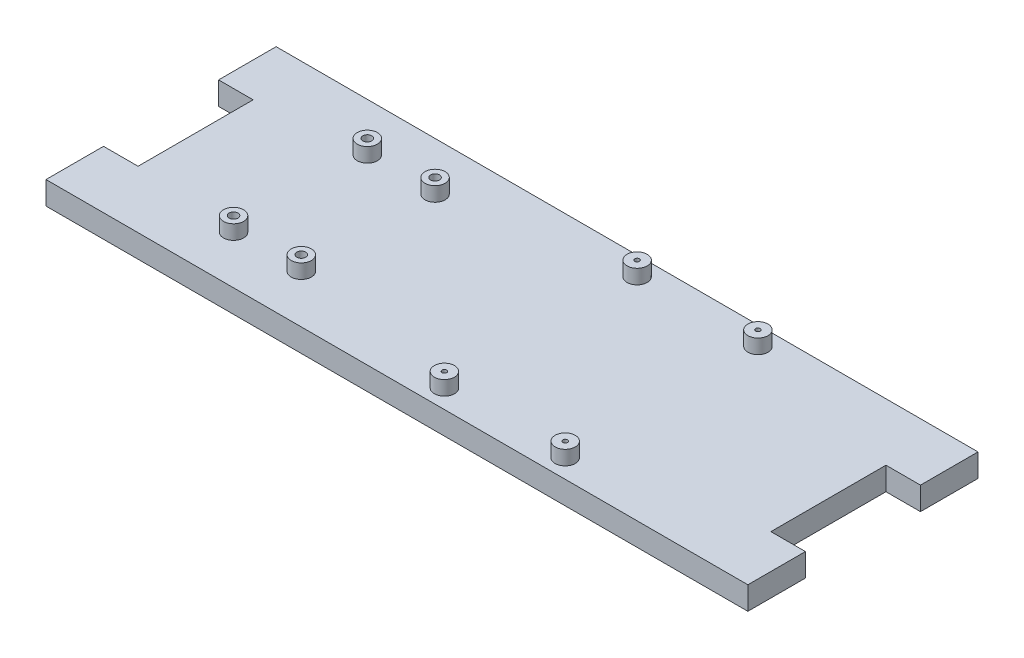
ISO-10303-21;
HEADER;
FILE_DESCRIPTION(('STEP AP214'),'2;1');
FILE_NAME('part.step','',(''),(''),'','','');
FILE_SCHEMA(('AUTOMOTIVE_DESIGN { 1 0 10303 214 1 1 1 1 }'));
ENDSEC;
DATA;
#1=APPLICATION_CONTEXT('core data for automotive mechanical design processes');
#2=APPLICATION_PROTOCOL_DEFINITION('international standard','automotive_design',2000,#1);
#3=PRODUCT_CONTEXT('',#1,'mechanical');
#4=PRODUCT('Part','Part','',(#3));
#5=PRODUCT_RELATED_PRODUCT_CATEGORY('part','',(#4));
#6=PRODUCT_DEFINITION_FORMATION('','',#4);
#7=PRODUCT_DEFINITION_CONTEXT('part definition',#1,'design');
#8=PRODUCT_DEFINITION('design','',#6,#7);
#9=PRODUCT_DEFINITION_SHAPE('','',#8);
#10=(LENGTH_UNIT() NAMED_UNIT(*) SI_UNIT(.MILLI.,.METRE.));
#11=(NAMED_UNIT(*) PLANE_ANGLE_UNIT() SI_UNIT($,.RADIAN.));
#12=(NAMED_UNIT(*) SI_UNIT($,.STERADIAN.) SOLID_ANGLE_UNIT());
#13=UNCERTAINTY_MEASURE_WITH_UNIT(LENGTH_MEASURE(1.E-05),#10,'distance_accuracy_value','');
#14=(GEOMETRIC_REPRESENTATION_CONTEXT(3) GLOBAL_UNCERTAINTY_ASSIGNED_CONTEXT((#13)) GLOBAL_UNIT_ASSIGNED_CONTEXT((#10,
#11,#12)) REPRESENTATION_CONTEXT('',''));
#15=CARTESIAN_POINT('',(0.,0.,0.));
#16=DIRECTION('',(0.,0.,1.));
#17=DIRECTION('',(1.,0.,0.));
#18=AXIS2_PLACEMENT_3D('',#15,#16,#17);
#19=CARTESIAN_POINT('',(0.,8.,0.));
#20=DIRECTION('',(0.,1.,0.));
#21=DIRECTION('',(0.,0.,1.));
#22=AXIS2_PLACEMENT_3D('',#19,#20,#21);
#23=PLANE('',#22);
#24=CARTESIAN_POINT('',(52.,8.,-33.5));
#25=DIRECTION('',(0.,1.,0.));
#26=DIRECTION('',(0.,0.,1.));
#27=AXIS2_PLACEMENT_3D('',#24,#25,#26);
#28=CIRCLE('',#27,3.5);
#29=CARTESIAN_POINT('',(52.,8.,-30.));
#30=VERTEX_POINT('',#29);
#31=EDGE_CURVE('E678',#30,#30,#28,.T.);
#32=ORIENTED_EDGE('',*,*,#31,.F.);
#33=EDGE_LOOP('',(#32));
#34=FACE_BOUND('',#33,.T.);
#35=CARTESIAN_POINT('',(10.,8.,33.5));
#36=DIRECTION('',(0.,1.,0.));
#37=DIRECTION('',(0.,0.,1.));
#38=AXIS2_PLACEMENT_3D('',#35,#36,#37);
#39=CIRCLE('',#38,3.5);
#40=CARTESIAN_POINT('',(10.,8.,37.));
#41=VERTEX_POINT('',#40);
#42=EDGE_CURVE('E696',#41,#41,#39,.T.);
#43=ORIENTED_EDGE('',*,*,#42,.F.);
#44=EDGE_LOOP('',(#43));
#45=FACE_BOUND('',#44,.T.);
#46=CARTESIAN_POINT('',(-73.55,8.,23.25));
#47=DIRECTION('',(0.,1.,0.));
#48=DIRECTION('',(0.,0.,1.));
#49=AXIS2_PLACEMENT_3D('',#46,#47,#48);
#50=CIRCLE('',#49,3.50000000000001);
#51=CARTESIAN_POINT('',(-73.55,8.,26.75));
#52=VERTEX_POINT('',#51);
#53=EDGE_CURVE('E714',#52,#52,#50,.T.);
#54=ORIENTED_EDGE('',*,*,#53,.F.);
#55=EDGE_LOOP('',(#54));
#56=FACE_BOUND('',#55,.T.);
#57=CARTESIAN_POINT('',(-73.55,8.,-23.25));
#58=DIRECTION('',(0.,1.,0.));
#59=DIRECTION('',(0.,0.,1.));
#60=AXIS2_PLACEMENT_3D('',#57,#58,#59);
#61=CIRCLE('',#60,3.50000000000001);
#62=CARTESIAN_POINT('',(-73.55,8.,-19.75));
#63=VERTEX_POINT('',#62);
#64=EDGE_CURVE('E734',#63,#63,#61,.T.);
#65=ORIENTED_EDGE('',*,*,#64,.F.);
#66=EDGE_LOOP('',(#65));
#67=FACE_BOUND('',#66,.T.);
#68=DIRECTION('',(1.,0.,0.));
#69=VECTOR('',#68,1.);
#70=CARTESIAN_POINT('',(-110.,8.,40.));
#71=LINE('',#70,#69);
#72=CARTESIAN_POINT('',(-122.,8.,40.));
#73=VERTEX_POINT('',#72);
#74=CARTESIAN_POINT('',(122.,8.,40.));
#75=VERTEX_POINT('',#74);
#76=EDGE_CURVE('E11',#73,#75,#71,.T.);
#77=ORIENTED_EDGE('',*,*,#76,.T.);
#78=DIRECTION('',(0.,0.,-1.));
#79=VECTOR('',#78,1.);
#80=CARTESIAN_POINT('',(122.,8.,40.));
#81=LINE('',#80,#79);
#82=CARTESIAN_POINT('',(122.,8.,20.));
#83=VERTEX_POINT('',#82);
#84=EDGE_CURVE('E188',#75,#83,#81,.T.);
#85=ORIENTED_EDGE('',*,*,#84,.T.);
#86=DIRECTION('',(-1.,0.,0.));
#87=VECTOR('',#86,1.);
#88=CARTESIAN_POINT('',(122.,8.,20.));
#89=LINE('',#88,#87);
#90=CARTESIAN_POINT('',(110.,8.,20.));
#91=VERTEX_POINT('',#90);
#92=EDGE_CURVE('E190',#83,#91,#89,.T.);
#93=ORIENTED_EDGE('',*,*,#92,.T.);
#94=DIRECTION('',(0.,0.,-1.));
#95=VECTOR('',#94,1.);
#96=CARTESIAN_POINT('',(110.,8.,-40.));
#97=LINE('',#96,#95);
#98=CARTESIAN_POINT('',(110.,8.,-20.));
#99=VERTEX_POINT('',#98);
#100=EDGE_CURVE('E218',#91,#99,#97,.T.);
#101=ORIENTED_EDGE('',*,*,#100,.T.);
#102=DIRECTION('',(-1.,0.,0.));
#103=VECTOR('',#102,1.);
#104=CARTESIAN_POINT('',(122.,8.,-20.));
#105=LINE('',#104,#103);
#106=CARTESIAN_POINT('',(122.,8.,-20.));
#107=VERTEX_POINT('',#106);
#108=EDGE_CURVE('E214',#107,#99,#105,.T.);
#109=ORIENTED_EDGE('',*,*,#108,.F.);
#110=DIRECTION('',(0.,0.,1.));
#111=VECTOR('',#110,1.);
#112=CARTESIAN_POINT('',(122.,8.,-40.));
#113=LINE('',#112,#111);
#114=CARTESIAN_POINT('',(122.,8.,-40.));
#115=VERTEX_POINT('',#114);
#116=EDGE_CURVE('E202',#115,#107,#113,.T.);
#117=ORIENTED_EDGE('',*,*,#116,.F.);
#118=DIRECTION('',(-1.,0.,0.));
#119=VECTOR('',#118,1.);
#120=CARTESIAN_POINT('',(-110.,8.,-40.));
#121=LINE('',#120,#119);
#122=CARTESIAN_POINT('',(-122.,8.,-40.));
#123=VERTEX_POINT('',#122);
#124=EDGE_CURVE('E220',#115,#123,#121,.T.);
#125=ORIENTED_EDGE('',*,*,#124,.T.);
#126=DIRECTION('',(0.,0.,1.));
#127=VECTOR('',#126,1.);
#128=CARTESIAN_POINT('',(-122.,8.,-40.));
#129=LINE('',#128,#127);
#130=CARTESIAN_POINT('',(-122.,8.,-20.));
#131=VERTEX_POINT('',#130);
#132=EDGE_CURVE('E172',#123,#131,#129,.T.);
#133=ORIENTED_EDGE('',*,*,#132,.T.);
#134=DIRECTION('',(1.,0.,0.));
#135=VECTOR('',#134,1.);
#136=CARTESIAN_POINT('',(-122.,8.,-20.));
#137=LINE('',#136,#135);
#138=CARTESIAN_POINT('',(-110.,8.,-20.));
#139=VERTEX_POINT('',#138);
#140=EDGE_CURVE('E175',#131,#139,#137,.T.);
#141=ORIENTED_EDGE('',*,*,#140,.T.);
#142=DIRECTION('',(0.,0.,1.));
#143=VECTOR('',#142,1.);
#144=CARTESIAN_POINT('',(-110.,8.,-40.));
#145=LINE('',#144,#143);
#146=CARTESIAN_POINT('',(-110.,8.,20.));
#147=VERTEX_POINT('',#146);
#148=EDGE_CURVE('E47',#139,#147,#145,.T.);
#149=ORIENTED_EDGE('',*,*,#148,.T.);
#150=DIRECTION('',(1.,0.,0.));
#151=VECTOR('',#150,1.);
#152=CARTESIAN_POINT('',(-122.,8.,20.));
#153=LINE('',#152,#151);
#154=CARTESIAN_POINT('',(-122.,8.,20.));
#155=VERTEX_POINT('',#154);
#156=EDGE_CURVE('E141',#155,#147,#153,.T.);
#157=ORIENTED_EDGE('',*,*,#156,.F.);
#158=DIRECTION('',(0.,0.,-1.));
#159=VECTOR('',#158,1.);
#160=CARTESIAN_POINT('',(-122.,8.,40.));
#161=LINE('',#160,#159);
#162=EDGE_CURVE('E138',#73,#155,#161,.T.);
#163=ORIENTED_EDGE('',*,*,#162,.F.);
#164=EDGE_LOOP('',(#77,#85,#93,#101,#109,#117,#125,#133,#141,#149,#157,#163));
#165=FACE_BOUND('',#164,.T.);
#166=CARTESIAN_POINT('',(-50.,8.,-23.25));
#167=DIRECTION('',(0.,1.,0.));
#168=DIRECTION('',(0.,0.,1.));
#169=AXIS2_PLACEMENT_3D('',#166,#167,#168);
#170=CIRCLE('',#169,3.5);
#171=CARTESIAN_POINT('',(-50.,8.,-19.75));
#172=VERTEX_POINT('',#171);
#173=EDGE_CURVE('E723',#172,#172,#170,.T.);
#174=ORIENTED_EDGE('',*,*,#173,.F.);
#175=EDGE_LOOP('',(#174));
#176=FACE_BOUND('',#175,.T.);
#177=CARTESIAN_POINT('',(-50.,8.,23.25));
#178=DIRECTION('',(0.,1.,0.));
#179=DIRECTION('',(0.,0.,1.));
#180=AXIS2_PLACEMENT_3D('',#177,#178,#179);
#181=CIRCLE('',#180,3.5);
#182=CARTESIAN_POINT('',(-50.,8.,26.75));
#183=VERTEX_POINT('',#182);
#184=EDGE_CURVE('E705',#183,#183,#181,.T.);
#185=ORIENTED_EDGE('',*,*,#184,.F.);
#186=EDGE_LOOP('',(#185));
#187=FACE_BOUND('',#186,.T.);
#188=CARTESIAN_POINT('',(52.,8.,33.5));
#189=DIRECTION('',(0.,1.,0.));
#190=DIRECTION('',(0.,0.,1.));
#191=AXIS2_PLACEMENT_3D('',#188,#189,#190);
#192=CIRCLE('',#191,3.5);
#193=CARTESIAN_POINT('',(52.,8.,37.));
#194=VERTEX_POINT('',#193);
#195=EDGE_CURVE('E687',#194,#194,#192,.T.);
#196=ORIENTED_EDGE('',*,*,#195,.F.);
#197=EDGE_LOOP('',(#196));
#198=FACE_BOUND('',#197,.T.);
#199=CARTESIAN_POINT('',(9.99999999999999,8.,-33.5));
#200=DIRECTION('',(0.,1.,0.));
#201=DIRECTION('',(0.,0.,1.));
#202=AXIS2_PLACEMENT_3D('',#199,#200,#201);
#203=CIRCLE('',#202,3.5);
#204=CARTESIAN_POINT('',(9.99999999999999,8.,-30.));
#205=VERTEX_POINT('',#204);
#206=EDGE_CURVE('E669',#205,#205,#203,.T.);
#207=ORIENTED_EDGE('',*,*,#206,.F.);
#208=EDGE_LOOP('',(#207));
#209=FACE_BOUND('',#208,.T.);
#210=ADVANCED_FACE('F38',(#34,#45,#56,#67,#165,#176,#187,#198,#209),#23,.T.);
#211=CARTESIAN_POINT('',(-110.,8.,-40.));
#212=DIRECTION('',(1.,0.,0.));
#213=DIRECTION('',(0.,0.,-1.));
#214=AXIS2_PLACEMENT_3D('',#211,#212,#213);
#215=PLANE('',#214);
#216=DIRECTION('',(0.,-1.,0.));
#217=VECTOR('',#216,1.);
#218=CARTESIAN_POINT('',(-110.,8.,20.));
#219=LINE('',#218,#217);
#220=CARTESIAN_POINT('',(-110.,0.,20.));
#221=VERTEX_POINT('',#220);
#222=EDGE_CURVE('E55',#147,#221,#219,.T.);
#223=ORIENTED_EDGE('',*,*,#222,.F.);
#224=ORIENTED_EDGE('',*,*,#148,.F.);
#225=DIRECTION('',(0.,-1.,0.));
#226=VECTOR('',#225,1.);
#227=CARTESIAN_POINT('',(-110.,8.,-20.));
#228=LINE('',#227,#226);
#229=CARTESIAN_POINT('',(-110.,0.,-20.));
#230=VERTEX_POINT('',#229);
#231=EDGE_CURVE('E162',#139,#230,#228,.T.);
#232=ORIENTED_EDGE('',*,*,#231,.T.);
#233=DIRECTION('',(0.,0.,1.));
#234=VECTOR('',#233,1.);
#235=CARTESIAN_POINT('',(-110.,0.,-40.));
#236=LINE('',#235,#234);
#237=EDGE_CURVE('E60',#230,#221,#236,.T.);
#238=ORIENTED_EDGE('',*,*,#237,.T.);
#239=EDGE_LOOP('',(#223,#224,#232,#238));
#240=FACE_BOUND('',#239,.T.);
#241=ADVANCED_FACE('F270',(#240),#215,.F.);
#242=CARTESIAN_POINT('',(110.,8.,-40.));
#243=DIRECTION('',(-1.,0.,0.));
#244=DIRECTION('',(0.,0.,1.));
#245=AXIS2_PLACEMENT_3D('',#242,#243,#244);
#246=PLANE('',#245);
#247=ORIENTED_EDGE('',*,*,#100,.F.);
#248=DIRECTION('',(0.,-1.,0.));
#249=VECTOR('',#248,1.);
#250=CARTESIAN_POINT('',(110.,8.,20.));
#251=LINE('',#250,#249);
#252=CARTESIAN_POINT('',(110.,0.,20.));
#253=VERTEX_POINT('',#252);
#254=EDGE_CURVE('E180',#91,#253,#251,.T.);
#255=ORIENTED_EDGE('',*,*,#254,.T.);
#256=DIRECTION('',(0.,0.,-1.));
#257=VECTOR('',#256,1.);
#258=CARTESIAN_POINT('',(110.,0.,-40.));
#259=LINE('',#258,#257);
#260=CARTESIAN_POINT('',(110.,0.,-20.));
#261=VERTEX_POINT('',#260);
#262=EDGE_CURVE('E217',#253,#261,#259,.T.);
#263=ORIENTED_EDGE('',*,*,#262,.T.);
#264=DIRECTION('',(0.,-1.,0.));
#265=VECTOR('',#264,1.);
#266=CARTESIAN_POINT('',(110.,8.,-20.));
#267=LINE('',#266,#265);
#268=EDGE_CURVE('E198',#99,#261,#267,.T.);
#269=ORIENTED_EDGE('',*,*,#268,.F.);
#270=EDGE_LOOP('',(#247,#255,#263,#269));
#271=FACE_BOUND('',#270,.T.);
#272=ADVANCED_FACE('F40',(#271),#246,.F.);
#273=CARTESIAN_POINT('',(-110.,8.,-40.));
#274=DIRECTION('',(0.,0.,1.));
#275=DIRECTION('',(1.,0.,0.));
#276=AXIS2_PLACEMENT_3D('',#273,#274,#275);
#277=PLANE('',#276);
#278=DIRECTION('',(-1.,0.,0.));
#279=VECTOR('',#278,1.);
#280=CARTESIAN_POINT('',(-110.,0.,-40.));
#281=LINE('',#280,#279);
#282=CARTESIAN_POINT('',(122.,0.,-40.));
#283=VERTEX_POINT('',#282);
#284=CARTESIAN_POINT('',(-122.,0.,-40.));
#285=VERTEX_POINT('',#284);
#286=EDGE_CURVE('E224',#283,#285,#281,.T.);
#287=ORIENTED_EDGE('',*,*,#286,.T.);
#288=DIRECTION('',(0.,1.,0.));
#289=VECTOR('',#288,1.);
#290=CARTESIAN_POINT('',(-122.,8.,-40.));
#291=LINE('',#290,#289);
#292=EDGE_CURVE('E163',#285,#123,#291,.T.);
#293=ORIENTED_EDGE('',*,*,#292,.T.);
#294=ORIENTED_EDGE('',*,*,#124,.F.);
#295=DIRECTION('',(0.,1.,0.));
#296=VECTOR('',#295,1.);
#297=CARTESIAN_POINT('',(122.,8.,-40.));
#298=LINE('',#297,#296);
#299=EDGE_CURVE('E199',#283,#115,#298,.T.);
#300=ORIENTED_EDGE('',*,*,#299,.F.);
#301=EDGE_LOOP('',(#287,#293,#294,#300));
#302=FACE_BOUND('',#301,.T.);
#303=ADVANCED_FACE('F249',(#302),#277,.F.);
#304=CARTESIAN_POINT('',(-110.,8.,40.));
#305=DIRECTION('',(0.,0.,-1.));
#306=DIRECTION('',(-1.,0.,0.));
#307=AXIS2_PLACEMENT_3D('',#304,#305,#306);
#308=PLANE('',#307);
#309=DIRECTION('',(1.,0.,0.));
#310=VECTOR('',#309,1.);
#311=CARTESIAN_POINT('',(-110.,0.,40.));
#312=LINE('',#311,#310);
#313=CARTESIAN_POINT('',(-122.,0.,40.));
#314=VERTEX_POINT('',#313);
#315=CARTESIAN_POINT('',(122.,0.,40.));
#316=VERTEX_POINT('',#315);
#317=EDGE_CURVE('E42',#314,#316,#312,.T.);
#318=ORIENTED_EDGE('',*,*,#317,.T.);
#319=DIRECTION('',(0.,1.,0.));
#320=VECTOR('',#319,1.);
#321=CARTESIAN_POINT('',(122.,8.,40.));
#322=LINE('',#321,#320);
#323=EDGE_CURVE('E133',#316,#75,#322,.T.);
#324=ORIENTED_EDGE('',*,*,#323,.T.);
#325=ORIENTED_EDGE('',*,*,#76,.F.);
#326=DIRECTION('',(0.,1.,0.));
#327=VECTOR('',#326,1.);
#328=CARTESIAN_POINT('',(-122.,8.,40.));
#329=LINE('',#328,#327);
#330=EDGE_CURVE('E131',#314,#73,#329,.T.);
#331=ORIENTED_EDGE('',*,*,#330,.F.);
#332=EDGE_LOOP('',(#318,#324,#325,#331));
#333=FACE_BOUND('',#332,.T.);
#334=ADVANCED_FACE('F129',(#333),#308,.F.);
#335=CARTESIAN_POINT('',(0.,0.,0.));
#336=DIRECTION('',(0.,1.,0.));
#337=DIRECTION('',(0.,0.,1.));
#338=AXIS2_PLACEMENT_3D('',#335,#336,#337);
#339=PLANE('',#338);
#340=CARTESIAN_POINT('',(52.,0.,-33.5));
#341=DIRECTION('',(0.,1.,0.));
#342=DIRECTION('',(0.,0.,1.));
#343=AXIS2_PLACEMENT_3D('',#340,#341,#342);
#344=CIRCLE('',#343,0.80000000000001);
#345=CARTESIAN_POINT('',(52.,0.,-32.7));
#346=VERTEX_POINT('',#345);
#347=EDGE_CURVE('E750',#346,#346,#344,.T.);
#348=ORIENTED_EDGE('',*,*,#347,.T.);
#349=EDGE_LOOP('',(#348));
#350=FACE_BOUND('',#349,.T.);
#351=CARTESIAN_POINT('',(52.,0.,33.5));
#352=DIRECTION('',(0.,1.,0.));
#353=DIRECTION('',(0.,0.,1.));
#354=AXIS2_PLACEMENT_3D('',#351,#352,#353);
#355=CIRCLE('',#354,0.799999999999981);
#356=CARTESIAN_POINT('',(52.,0.,34.3));
#357=VERTEX_POINT('',#356);
#358=EDGE_CURVE('E753',#357,#357,#355,.T.);
#359=ORIENTED_EDGE('',*,*,#358,.T.);
#360=EDGE_LOOP('',(#359));
#361=FACE_BOUND('',#360,.T.);
#362=CARTESIAN_POINT('',(10.,0.,33.5));
#363=DIRECTION('',(0.,1.,0.));
#364=DIRECTION('',(0.,0.,1.));
#365=AXIS2_PLACEMENT_3D('',#362,#363,#364);
#366=CIRCLE('',#365,0.799999999999983);
#367=CARTESIAN_POINT('',(10.,0.,34.3));
#368=VERTEX_POINT('',#367);
#369=EDGE_CURVE('E756',#368,#368,#366,.T.);
#370=ORIENTED_EDGE('',*,*,#369,.T.);
#371=EDGE_LOOP('',(#370));
#372=FACE_BOUND('',#371,.T.);
#373=CARTESIAN_POINT('',(-73.55,0.,-23.25));
#374=DIRECTION('',(0.,1.,0.));
#375=DIRECTION('',(0.,0.,1.));
#376=AXIS2_PLACEMENT_3D('',#373,#374,#375);
#377=CIRCLE('',#376,1.54999999999999);
#378=CARTESIAN_POINT('',(-73.55,0.,-21.7));
#379=VERTEX_POINT('',#378);
#380=EDGE_CURVE('E744',#379,#379,#377,.T.);
#381=ORIENTED_EDGE('',*,*,#380,.T.);
#382=EDGE_LOOP('',(#381));
#383=FACE_BOUND('',#382,.T.);
#384=CARTESIAN_POINT('',(-50.,0.,-23.25));
#385=DIRECTION('',(0.,1.,0.));
#386=DIRECTION('',(0.,0.,1.));
#387=AXIS2_PLACEMENT_3D('',#384,#385,#386);
#388=CIRCLE('',#387,1.54999999999999);
#389=CARTESIAN_POINT('',(-50.,0.,-21.7));
#390=VERTEX_POINT('',#389);
#391=EDGE_CURVE('E741',#390,#390,#388,.T.);
#392=ORIENTED_EDGE('',*,*,#391,.T.);
#393=EDGE_LOOP('',(#392));
#394=FACE_BOUND('',#393,.T.);
#395=CARTESIAN_POINT('',(-50.,0.,23.25));
#396=DIRECTION('',(0.,1.,0.));
#397=DIRECTION('',(0.,0.,1.));
#398=AXIS2_PLACEMENT_3D('',#395,#396,#397);
#399=CIRCLE('',#398,1.54999999999999);
#400=CARTESIAN_POINT('',(-50.,0.,24.8));
#401=VERTEX_POINT('',#400);
#402=EDGE_CURVE('E745',#401,#401,#399,.T.);
#403=ORIENTED_EDGE('',*,*,#402,.T.);
#404=EDGE_LOOP('',(#403));
#405=FACE_BOUND('',#404,.T.);
#406=CARTESIAN_POINT('',(-73.55,0.,23.25));
#407=DIRECTION('',(0.,1.,0.));
#408=DIRECTION('',(0.,0.,1.));
#409=AXIS2_PLACEMENT_3D('',#406,#407,#408);
#410=CIRCLE('',#409,1.54999999999999);
#411=CARTESIAN_POINT('',(-73.55,0.,24.8));
#412=VERTEX_POINT('',#411);
#413=EDGE_CURVE('E738',#412,#412,#410,.T.);
#414=ORIENTED_EDGE('',*,*,#413,.T.);
#415=EDGE_LOOP('',(#414));
#416=FACE_BOUND('',#415,.T.);
#417=CARTESIAN_POINT('',(9.99999999999999,0.,-33.5));
#418=DIRECTION('',(0.,1.,0.));
#419=DIRECTION('',(0.,0.,1.));
#420=AXIS2_PLACEMENT_3D('',#417,#418,#419);
#421=CIRCLE('',#420,0.800000000000011);
#422=CARTESIAN_POINT('',(9.99999999999999,0.,-32.7));
#423=VERTEX_POINT('',#422);
#424=EDGE_CURVE('E151',#423,#423,#421,.T.);
#425=ORIENTED_EDGE('',*,*,#424,.T.);
#426=EDGE_LOOP('',(#425));
#427=FACE_BOUND('',#426,.T.);
#428=ORIENTED_EDGE('',*,*,#262,.F.);
#429=DIRECTION('',(-1.,0.,0.));
#430=VECTOR('',#429,1.);
#431=CARTESIAN_POINT('',(122.,0.,20.));
#432=LINE('',#431,#430);
#433=CARTESIAN_POINT('',(122.,0.,20.));
#434=VERTEX_POINT('',#433);
#435=EDGE_CURVE('E195',#434,#253,#432,.T.);
#436=ORIENTED_EDGE('',*,*,#435,.F.);
#437=DIRECTION('',(0.,0.,1.));
#438=VECTOR('',#437,1.);
#439=CARTESIAN_POINT('',(122.,0.,40.));
#440=LINE('',#439,#438);
#441=EDGE_CURVE('E182',#434,#316,#440,.T.);
#442=ORIENTED_EDGE('',*,*,#441,.T.);
#443=ORIENTED_EDGE('',*,*,#317,.F.);
#444=DIRECTION('',(0.,0.,1.));
#445=VECTOR('',#444,1.);
#446=CARTESIAN_POINT('',(-122.,0.,40.));
#447=LINE('',#446,#445);
#448=CARTESIAN_POINT('',(-122.,0.,20.));
#449=VERTEX_POINT('',#448);
#450=EDGE_CURVE('E149',#449,#314,#447,.T.);
#451=ORIENTED_EDGE('',*,*,#450,.F.);
#452=DIRECTION('',(1.,0.,0.));
#453=VECTOR('',#452,1.);
#454=CARTESIAN_POINT('',(-122.,0.,20.));
#455=LINE('',#454,#453);
#456=EDGE_CURVE('E157',#449,#221,#455,.T.);
#457=ORIENTED_EDGE('',*,*,#456,.T.);
#458=ORIENTED_EDGE('',*,*,#237,.F.);
#459=DIRECTION('',(1.,0.,0.));
#460=VECTOR('',#459,1.);
#461=CARTESIAN_POINT('',(-122.,0.,-20.));
#462=LINE('',#461,#460);
#463=CARTESIAN_POINT('',(-122.,0.,-20.));
#464=VERTEX_POINT('',#463);
#465=EDGE_CURVE('E178',#464,#230,#462,.T.);
#466=ORIENTED_EDGE('',*,*,#465,.F.);
#467=DIRECTION('',(0.,0.,-1.));
#468=VECTOR('',#467,1.);
#469=CARTESIAN_POINT('',(-122.,0.,-40.));
#470=LINE('',#469,#468);
#471=EDGE_CURVE('E166',#464,#285,#470,.T.);
#472=ORIENTED_EDGE('',*,*,#471,.T.);
#473=ORIENTED_EDGE('',*,*,#286,.F.);
#474=DIRECTION('',(0.,0.,-1.));
#475=VECTOR('',#474,1.);
#476=CARTESIAN_POINT('',(122.,0.,-40.));
#477=LINE('',#476,#475);
#478=CARTESIAN_POINT('',(122.,0.,-20.));
#479=VERTEX_POINT('',#478);
#480=EDGE_CURVE('E206',#479,#283,#477,.T.);
#481=ORIENTED_EDGE('',*,*,#480,.F.);
#482=DIRECTION('',(-1.,0.,0.));
#483=VECTOR('',#482,1.);
#484=CARTESIAN_POINT('',(122.,0.,-20.));
#485=LINE('',#484,#483);
#486=EDGE_CURVE('E209',#479,#261,#485,.T.);
#487=ORIENTED_EDGE('',*,*,#486,.T.);
#488=EDGE_LOOP('',(#428,#436,#442,#443,#451,#457,#458,#466,#472,#473,#481,#487));
#489=FACE_BOUND('',#488,.T.);
#490=ADVANCED_FACE('F230',(#350,#361,#372,#383,#394,#405,#416,#427,#489),#339,.F.);
#491=CARTESIAN_POINT('',(122.,8.,-20.));
#492=DIRECTION('',(0.,0.,-1.));
#493=DIRECTION('',(0.,1.,0.));
#494=AXIS2_PLACEMENT_3D('',#491,#492,#493);
#495=PLANE('',#494);
#496=ORIENTED_EDGE('',*,*,#268,.T.);
#497=ORIENTED_EDGE('',*,*,#486,.F.);
#498=DIRECTION('',(0.,-1.,0.));
#499=VECTOR('',#498,1.);
#500=CARTESIAN_POINT('',(122.,8.,-20.));
#501=LINE('',#500,#499);
#502=EDGE_CURVE('E204',#107,#479,#501,.T.);
#503=ORIENTED_EDGE('',*,*,#502,.F.);
#504=ORIENTED_EDGE('',*,*,#108,.T.);
#505=EDGE_LOOP('',(#496,#497,#503,#504));
#506=FACE_BOUND('',#505,.T.);
#507=ADVANCED_FACE('F241',(#506),#495,.F.);
#508=CARTESIAN_POINT('',(122.,1.90819582357449E-13,0.));
#509=DIRECTION('',(-1.,0.,0.));
#510=DIRECTION('',(0.,-1.,0.));
#511=AXIS2_PLACEMENT_3D('',#508,#509,#510);
#512=PLANE('',#511);
#513=ORIENTED_EDGE('',*,*,#299,.T.);
#514=ORIENTED_EDGE('',*,*,#116,.T.);
#515=ORIENTED_EDGE('',*,*,#502,.T.);
#516=ORIENTED_EDGE('',*,*,#480,.T.);
#517=EDGE_LOOP('',(#513,#514,#515,#516));
#518=FACE_BOUND('',#517,.T.);
#519=ADVANCED_FACE('F244',(#518),#512,.F.);
#520=CARTESIAN_POINT('',(122.,8.,20.));
#521=DIRECTION('',(0.,0.,-1.));
#522=DIRECTION('',(0.,1.,0.));
#523=AXIS2_PLACEMENT_3D('',#520,#521,#522);
#524=PLANE('',#523);
#525=ORIENTED_EDGE('',*,*,#254,.F.);
#526=ORIENTED_EDGE('',*,*,#92,.F.);
#527=DIRECTION('',(0.,-1.,0.));
#528=VECTOR('',#527,1.);
#529=CARTESIAN_POINT('',(122.,8.,20.));
#530=LINE('',#529,#528);
#531=EDGE_CURVE('E185',#83,#434,#530,.T.);
#532=ORIENTED_EDGE('',*,*,#531,.T.);
#533=ORIENTED_EDGE('',*,*,#435,.T.);
#534=EDGE_LOOP('',(#525,#526,#532,#533));
#535=FACE_BOUND('',#534,.T.);
#536=ADVANCED_FACE('F233',(#535),#524,.T.);
#537=CARTESIAN_POINT('',(122.,1.90819582357449E-13,0.));
#538=DIRECTION('',(-1.,0.,0.));
#539=DIRECTION('',(0.,-1.,0.));
#540=AXIS2_PLACEMENT_3D('',#537,#538,#539);
#541=PLANE('',#540);
#542=ORIENTED_EDGE('',*,*,#323,.F.);
#543=ORIENTED_EDGE('',*,*,#441,.F.);
#544=ORIENTED_EDGE('',*,*,#531,.F.);
#545=ORIENTED_EDGE('',*,*,#84,.F.);
#546=EDGE_LOOP('',(#542,#543,#544,#545));
#547=FACE_BOUND('',#546,.T.);
#548=ADVANCED_FACE('F228',(#547),#541,.F.);
#549=CARTESIAN_POINT('',(-122.,8.,-20.));
#550=DIRECTION('',(0.,0.,1.));
#551=DIRECTION('',(0.,-1.,0.));
#552=AXIS2_PLACEMENT_3D('',#549,#550,#551);
#553=PLANE('',#552);
#554=ORIENTED_EDGE('',*,*,#231,.F.);
#555=ORIENTED_EDGE('',*,*,#140,.F.);
#556=DIRECTION('',(0.,-1.,0.));
#557=VECTOR('',#556,1.);
#558=CARTESIAN_POINT('',(-122.,8.,-20.));
#559=LINE('',#558,#557);
#560=EDGE_CURVE('E169',#131,#464,#559,.T.);
#561=ORIENTED_EDGE('',*,*,#560,.T.);
#562=ORIENTED_EDGE('',*,*,#465,.T.);
#563=EDGE_LOOP('',(#554,#555,#561,#562));
#564=FACE_BOUND('',#563,.T.);
#565=ADVANCED_FACE('F256',(#564),#553,.T.);
#566=CARTESIAN_POINT('',(-122.,1.90819582357449E-13,0.));
#567=DIRECTION('',(1.,0.,0.));
#568=DIRECTION('',(0.,-1.,0.));
#569=AXIS2_PLACEMENT_3D('',#566,#567,#568);
#570=PLANE('',#569);
#571=ORIENTED_EDGE('',*,*,#292,.F.);
#572=ORIENTED_EDGE('',*,*,#471,.F.);
#573=ORIENTED_EDGE('',*,*,#560,.F.);
#574=ORIENTED_EDGE('',*,*,#132,.F.);
#575=EDGE_LOOP('',(#571,#572,#573,#574));
#576=FACE_BOUND('',#575,.T.);
#577=ADVANCED_FACE('F253',(#576),#570,.F.);
#578=CARTESIAN_POINT('',(-122.,8.,20.));
#579=DIRECTION('',(0.,0.,1.));
#580=DIRECTION('',(0.,-1.,0.));
#581=AXIS2_PLACEMENT_3D('',#578,#579,#580);
#582=PLANE('',#581);
#583=ORIENTED_EDGE('',*,*,#222,.T.);
#584=ORIENTED_EDGE('',*,*,#456,.F.);
#585=DIRECTION('',(0.,-1.,0.));
#586=VECTOR('',#585,1.);
#587=CARTESIAN_POINT('',(-122.,8.,20.));
#588=LINE('',#587,#586);
#589=EDGE_CURVE('E144',#155,#449,#588,.T.);
#590=ORIENTED_EDGE('',*,*,#589,.F.);
#591=ORIENTED_EDGE('',*,*,#156,.T.);
#592=EDGE_LOOP('',(#583,#584,#590,#591));
#593=FACE_BOUND('',#592,.T.);
#594=ADVANCED_FACE('F258',(#593),#582,.F.);
#595=CARTESIAN_POINT('',(-122.,1.90819582357449E-13,0.));
#596=DIRECTION('',(1.,0.,0.));
#597=DIRECTION('',(0.,-1.,0.));
#598=AXIS2_PLACEMENT_3D('',#595,#596,#597);
#599=PLANE('',#598);
#600=ORIENTED_EDGE('',*,*,#330,.T.);
#601=ORIENTED_EDGE('',*,*,#162,.T.);
#602=ORIENTED_EDGE('',*,*,#589,.T.);
#603=ORIENTED_EDGE('',*,*,#450,.T.);
#604=EDGE_LOOP('',(#600,#601,#602,#603));
#605=FACE_BOUND('',#604,.T.);
#606=ADVANCED_FACE('F147',(#605),#599,.F.);
#607=CARTESIAN_POINT('',(9.99999999999999,0.,-33.5));
#608=DIRECTION('',(0.,1.,0.));
#609=DIRECTION('',(0.,0.,1.));
#610=AXIS2_PLACEMENT_3D('',#607,#608,#609);
#611=CYLINDRICAL_SURFACE('',#610,0.800000000000011);
#612=ORIENTED_EDGE('',*,*,#424,.F.);
#613=EDGE_LOOP('',(#612));
#614=FACE_BOUND('',#613,.T.);
#615=CARTESIAN_POINT('',(9.99999999999999,13.,-33.5));
#616=DIRECTION('',(0.,1.,0.));
#617=DIRECTION('',(0.,0.,1.));
#618=AXIS2_PLACEMENT_3D('',#615,#616,#617);
#619=CIRCLE('',#618,0.80000000000001);
#620=CARTESIAN_POINT('',(9.99999999999999,13.,-32.7));
#621=VERTEX_POINT('',#620);
#622=EDGE_CURVE('E671',#621,#621,#619,.T.);
#623=ORIENTED_EDGE('',*,*,#622,.T.);
#624=EDGE_LOOP('',(#623));
#625=FACE_BOUND('',#624,.T.);
#626=ADVANCED_FACE('F266',(#614,#625),#611,.F.);
#627=CARTESIAN_POINT('',(-73.55,0.,23.25));
#628=DIRECTION('',(0.,1.,0.));
#629=DIRECTION('',(0.,0.,1.));
#630=AXIS2_PLACEMENT_3D('',#627,#628,#629);
#631=CYLINDRICAL_SURFACE('',#630,1.54999999999999);
#632=ORIENTED_EDGE('',*,*,#413,.F.);
#633=EDGE_LOOP('',(#632));
#634=FACE_BOUND('',#633,.T.);
#635=CARTESIAN_POINT('',(-73.55,13.,23.25));
#636=DIRECTION('',(0.,1.,0.));
#637=DIRECTION('',(0.,0.,1.));
#638=AXIS2_PLACEMENT_3D('',#635,#636,#637);
#639=CIRCLE('',#638,1.54999999999999);
#640=CARTESIAN_POINT('',(-73.55,13.,24.8));
#641=VERTEX_POINT('',#640);
#642=EDGE_CURVE('E717',#641,#641,#639,.T.);
#643=ORIENTED_EDGE('',*,*,#642,.T.);
#644=EDGE_LOOP('',(#643));
#645=FACE_BOUND('',#644,.T.);
#646=ADVANCED_FACE('F391',(#634,#645),#631,.F.);
#647=CARTESIAN_POINT('',(-50.,0.,23.25));
#648=DIRECTION('',(0.,1.,0.));
#649=DIRECTION('',(0.,0.,1.));
#650=AXIS2_PLACEMENT_3D('',#647,#648,#649);
#651=CYLINDRICAL_SURFACE('',#650,1.54999999999999);
#652=ORIENTED_EDGE('',*,*,#402,.F.);
#653=EDGE_LOOP('',(#652));
#654=FACE_BOUND('',#653,.T.);
#655=CARTESIAN_POINT('',(-50.,13.,23.25));
#656=DIRECTION('',(0.,1.,0.));
#657=DIRECTION('',(0.,0.,1.));
#658=AXIS2_PLACEMENT_3D('',#655,#656,#657);
#659=CIRCLE('',#658,1.54999999999999);
#660=CARTESIAN_POINT('',(-50.,13.,24.8));
#661=VERTEX_POINT('',#660);
#662=EDGE_CURVE('E708',#661,#661,#659,.T.);
#663=ORIENTED_EDGE('',*,*,#662,.T.);
#664=EDGE_LOOP('',(#663));
#665=FACE_BOUND('',#664,.T.);
#666=ADVANCED_FACE('F403',(#654,#665),#651,.F.);
#667=CARTESIAN_POINT('',(-50.,0.,-23.25));
#668=DIRECTION('',(0.,1.,0.));
#669=DIRECTION('',(0.,0.,1.));
#670=AXIS2_PLACEMENT_3D('',#667,#668,#669);
#671=CYLINDRICAL_SURFACE('',#670,1.54999999999999);
#672=ORIENTED_EDGE('',*,*,#391,.F.);
#673=EDGE_LOOP('',(#672));
#674=FACE_BOUND('',#673,.T.);
#675=CARTESIAN_POINT('',(-50.,13.,-23.25));
#676=DIRECTION('',(0.,1.,0.));
#677=DIRECTION('',(0.,0.,1.));
#678=AXIS2_PLACEMENT_3D('',#675,#676,#677);
#679=CIRCLE('',#678,1.54999999999999);
#680=CARTESIAN_POINT('',(-50.,13.,-21.7));
#681=VERTEX_POINT('',#680);
#682=EDGE_CURVE('E726',#681,#681,#679,.T.);
#683=ORIENTED_EDGE('',*,*,#682,.T.);
#684=EDGE_LOOP('',(#683));
#685=FACE_BOUND('',#684,.T.);
#686=ADVANCED_FACE('F415',(#674,#685),#671,.F.);
#687=CARTESIAN_POINT('',(-73.55,0.,-23.25));
#688=DIRECTION('',(0.,1.,0.));
#689=DIRECTION('',(0.,0.,1.));
#690=AXIS2_PLACEMENT_3D('',#687,#688,#689);
#691=CYLINDRICAL_SURFACE('',#690,1.54999999999999);
#692=ORIENTED_EDGE('',*,*,#380,.F.);
#693=EDGE_LOOP('',(#692));
#694=FACE_BOUND('',#693,.T.);
#695=CARTESIAN_POINT('',(-73.55,13.,-23.25));
#696=DIRECTION('',(0.,1.,0.));
#697=DIRECTION('',(0.,0.,1.));
#698=AXIS2_PLACEMENT_3D('',#695,#696,#697);
#699=CIRCLE('',#698,1.54999999999999);
#700=CARTESIAN_POINT('',(-73.55,13.,-21.7));
#701=VERTEX_POINT('',#700);
#702=EDGE_CURVE('E731',#701,#701,#699,.T.);
#703=ORIENTED_EDGE('',*,*,#702,.T.);
#704=EDGE_LOOP('',(#703));
#705=FACE_BOUND('',#704,.T.);
#706=ADVANCED_FACE('F427',(#694,#705),#691,.F.);
#707=CARTESIAN_POINT('',(10.,0.,33.5));
#708=DIRECTION('',(0.,1.,0.));
#709=DIRECTION('',(0.,0.,1.));
#710=AXIS2_PLACEMENT_3D('',#707,#708,#709);
#711=CYLINDRICAL_SURFACE('',#710,0.799999999999983);
#712=ORIENTED_EDGE('',*,*,#369,.F.);
#713=EDGE_LOOP('',(#712));
#714=FACE_BOUND('',#713,.T.);
#715=CARTESIAN_POINT('',(10.,13.,33.5));
#716=DIRECTION('',(0.,1.,0.));
#717=DIRECTION('',(0.,0.,1.));
#718=AXIS2_PLACEMENT_3D('',#715,#716,#717);
#719=CIRCLE('',#718,0.799999999999981);
#720=CARTESIAN_POINT('',(10.,13.,34.3));
#721=VERTEX_POINT('',#720);
#722=EDGE_CURVE('E699',#721,#721,#719,.T.);
#723=ORIENTED_EDGE('',*,*,#722,.T.);
#724=EDGE_LOOP('',(#723));
#725=FACE_BOUND('',#724,.T.);
#726=ADVANCED_FACE('F439',(#714,#725),#711,.F.);
#727=CARTESIAN_POINT('',(52.,0.,33.5));
#728=DIRECTION('',(0.,1.,0.));
#729=DIRECTION('',(0.,0.,1.));
#730=AXIS2_PLACEMENT_3D('',#727,#728,#729);
#731=CYLINDRICAL_SURFACE('',#730,0.799999999999981);
#732=ORIENTED_EDGE('',*,*,#358,.F.);
#733=EDGE_LOOP('',(#732));
#734=FACE_BOUND('',#733,.T.);
#735=CARTESIAN_POINT('',(52.,13.,33.5));
#736=DIRECTION('',(0.,1.,0.));
#737=DIRECTION('',(0.,0.,1.));
#738=AXIS2_PLACEMENT_3D('',#735,#736,#737);
#739=CIRCLE('',#738,0.799999999999981);
#740=CARTESIAN_POINT('',(52.,13.,34.3));
#741=VERTEX_POINT('',#740);
#742=EDGE_CURVE('E690',#741,#741,#739,.T.);
#743=ORIENTED_EDGE('',*,*,#742,.T.);
#744=EDGE_LOOP('',(#743));
#745=FACE_BOUND('',#744,.T.);
#746=ADVANCED_FACE('F451',(#734,#745),#731,.F.);
#747=CARTESIAN_POINT('',(52.,0.,-33.5));
#748=DIRECTION('',(0.,1.,0.));
#749=DIRECTION('',(0.,0.,1.));
#750=AXIS2_PLACEMENT_3D('',#747,#748,#749);
#751=CYLINDRICAL_SURFACE('',#750,0.80000000000001);
#752=ORIENTED_EDGE('',*,*,#347,.F.);
#753=EDGE_LOOP('',(#752));
#754=FACE_BOUND('',#753,.T.);
#755=CARTESIAN_POINT('',(52.,13.,-33.5));
#756=DIRECTION('',(0.,1.,0.));
#757=DIRECTION('',(0.,0.,1.));
#758=AXIS2_PLACEMENT_3D('',#755,#756,#757);
#759=CIRCLE('',#758,0.80000000000001);
#760=CARTESIAN_POINT('',(52.,13.,-32.7));
#761=VERTEX_POINT('',#760);
#762=EDGE_CURVE('E681',#761,#761,#759,.T.);
#763=ORIENTED_EDGE('',*,*,#762,.T.);
#764=EDGE_LOOP('',(#763));
#765=FACE_BOUND('',#764,.T.);
#766=ADVANCED_FACE('F463',(#754,#765),#751,.F.);
#767=CARTESIAN_POINT('',(-73.55,13.,-23.25));
#768=DIRECTION('',(0.,1.,0.));
#769=DIRECTION('',(0.,0.,1.));
#770=AXIS2_PLACEMENT_3D('',#767,#768,#769);
#771=PLANE('',#770);
#772=CARTESIAN_POINT('',(-73.55,13.,-23.25));
#773=DIRECTION('',(0.,1.,0.));
#774=DIRECTION('',(0.,0.,1.));
#775=AXIS2_PLACEMENT_3D('',#772,#773,#774);
#776=CIRCLE('',#775,3.50000000000001);
#777=CARTESIAN_POINT('',(-73.55,13.,-19.75));
#778=VERTEX_POINT('',#777);
#779=EDGE_CURVE('E735',#778,#778,#776,.T.);
#780=ORIENTED_EDGE('',*,*,#779,.T.);
#781=EDGE_LOOP('',(#780));
#782=FACE_BOUND('',#781,.T.);
#783=ORIENTED_EDGE('',*,*,#702,.F.);
#784=EDGE_LOOP('',(#783));
#785=FACE_BOUND('',#784,.T.);
#786=ADVANCED_FACE('F475',(#782,#785),#771,.T.);
#787=CARTESIAN_POINT('',(-73.55,13.,-23.25));
#788=DIRECTION('',(0.,-1.,0.));
#789=DIRECTION('',(0.,0.,-1.));
#790=AXIS2_PLACEMENT_3D('',#787,#788,#789);
#791=CYLINDRICAL_SURFACE('',#790,3.50000000000001);
#792=ORIENTED_EDGE('',*,*,#779,.F.);
#793=EDGE_LOOP('',(#792));
#794=FACE_BOUND('',#793,.T.);
#795=ORIENTED_EDGE('',*,*,#64,.T.);
#796=EDGE_LOOP('',(#795));
#797=FACE_BOUND('',#796,.T.);
#798=ADVANCED_FACE('F501',(#794,#797),#791,.T.);
#799=CARTESIAN_POINT('',(-50.,13.,-23.25));
#800=DIRECTION('',(0.,1.,0.));
#801=DIRECTION('',(0.,0.,1.));
#802=AXIS2_PLACEMENT_3D('',#799,#800,#801);
#803=PLANE('',#802);
#804=CARTESIAN_POINT('',(-50.,13.,-23.25));
#805=DIRECTION('',(0.,1.,0.));
#806=DIRECTION('',(0.,0.,1.));
#807=AXIS2_PLACEMENT_3D('',#804,#805,#806);
#808=CIRCLE('',#807,3.5);
#809=CARTESIAN_POINT('',(-50.,13.,-19.75));
#810=VERTEX_POINT('',#809);
#811=EDGE_CURVE('E722',#810,#810,#808,.T.);
#812=ORIENTED_EDGE('',*,*,#811,.T.);
#813=EDGE_LOOP('',(#812));
#814=FACE_BOUND('',#813,.T.);
#815=ORIENTED_EDGE('',*,*,#682,.F.);
#816=EDGE_LOOP('',(#815));
#817=FACE_BOUND('',#816,.T.);
#818=ADVANCED_FACE('F510',(#814,#817),#803,.T.);
#819=CARTESIAN_POINT('',(-50.,13.,-23.25));
#820=DIRECTION('',(0.,-1.,0.));
#821=DIRECTION('',(0.,0.,-1.));
#822=AXIS2_PLACEMENT_3D('',#819,#820,#821);
#823=CYLINDRICAL_SURFACE('',#822,3.5);
#824=ORIENTED_EDGE('',*,*,#811,.F.);
#825=EDGE_LOOP('',(#824));
#826=FACE_BOUND('',#825,.T.);
#827=ORIENTED_EDGE('',*,*,#173,.T.);
#828=EDGE_LOOP('',(#827));
#829=FACE_BOUND('',#828,.T.);
#830=ADVANCED_FACE('F519',(#826,#829),#823,.T.);
#831=CARTESIAN_POINT('',(-73.55,13.,23.25));
#832=DIRECTION('',(0.,1.,0.));
#833=DIRECTION('',(0.,0.,1.));
#834=AXIS2_PLACEMENT_3D('',#831,#832,#833);
#835=PLANE('',#834);
#836=CARTESIAN_POINT('',(-73.55,13.,23.25));
#837=DIRECTION('',(0.,1.,0.));
#838=DIRECTION('',(0.,0.,1.));
#839=AXIS2_PLACEMENT_3D('',#836,#837,#838);
#840=CIRCLE('',#839,3.50000000000001);
#841=CARTESIAN_POINT('',(-73.55,13.,26.75));
#842=VERTEX_POINT('',#841);
#843=EDGE_CURVE('E713',#842,#842,#840,.T.);
#844=ORIENTED_EDGE('',*,*,#843,.T.);
#845=EDGE_LOOP('',(#844));
#846=FACE_BOUND('',#845,.T.);
#847=ORIENTED_EDGE('',*,*,#642,.F.);
#848=EDGE_LOOP('',(#847));
#849=FACE_BOUND('',#848,.T.);
#850=ADVANCED_FACE('F528',(#846,#849),#835,.T.);
#851=CARTESIAN_POINT('',(-73.55,13.,23.25));
#852=DIRECTION('',(0.,-1.,0.));
#853=DIRECTION('',(0.,0.,-1.));
#854=AXIS2_PLACEMENT_3D('',#851,#852,#853);
#855=CYLINDRICAL_SURFACE('',#854,3.50000000000001);
#856=ORIENTED_EDGE('',*,*,#843,.F.);
#857=EDGE_LOOP('',(#856));
#858=FACE_BOUND('',#857,.T.);
#859=ORIENTED_EDGE('',*,*,#53,.T.);
#860=EDGE_LOOP('',(#859));
#861=FACE_BOUND('',#860,.T.);
#862=ADVANCED_FACE('F537',(#858,#861),#855,.T.);
#863=CARTESIAN_POINT('',(-50.,13.,23.25));
#864=DIRECTION('',(0.,1.,0.));
#865=DIRECTION('',(0.,0.,1.));
#866=AXIS2_PLACEMENT_3D('',#863,#864,#865);
#867=PLANE('',#866);
#868=CARTESIAN_POINT('',(-50.,13.,23.25));
#869=DIRECTION('',(0.,1.,0.));
#870=DIRECTION('',(0.,0.,1.));
#871=AXIS2_PLACEMENT_3D('',#868,#869,#870);
#872=CIRCLE('',#871,3.5);
#873=CARTESIAN_POINT('',(-50.,13.,26.75));
#874=VERTEX_POINT('',#873);
#875=EDGE_CURVE('E704',#874,#874,#872,.T.);
#876=ORIENTED_EDGE('',*,*,#875,.T.);
#877=EDGE_LOOP('',(#876));
#878=FACE_BOUND('',#877,.T.);
#879=ORIENTED_EDGE('',*,*,#662,.F.);
#880=EDGE_LOOP('',(#879));
#881=FACE_BOUND('',#880,.T.);
#882=ADVANCED_FACE('F546',(#878,#881),#867,.T.);
#883=CARTESIAN_POINT('',(-50.,13.,23.25));
#884=DIRECTION('',(0.,-1.,0.));
#885=DIRECTION('',(0.,0.,-1.));
#886=AXIS2_PLACEMENT_3D('',#883,#884,#885);
#887=CYLINDRICAL_SURFACE('',#886,3.5);
#888=ORIENTED_EDGE('',*,*,#875,.F.);
#889=EDGE_LOOP('',(#888));
#890=FACE_BOUND('',#889,.T.);
#891=ORIENTED_EDGE('',*,*,#184,.T.);
#892=EDGE_LOOP('',(#891));
#893=FACE_BOUND('',#892,.T.);
#894=ADVANCED_FACE('F555',(#890,#893),#887,.T.);
#895=CARTESIAN_POINT('',(10.,13.,33.5));
#896=DIRECTION('',(0.,1.,0.));
#897=DIRECTION('',(0.,0.,1.));
#898=AXIS2_PLACEMENT_3D('',#895,#896,#897);
#899=PLANE('',#898);
#900=CARTESIAN_POINT('',(10.,13.,33.5));
#901=DIRECTION('',(0.,1.,0.));
#902=DIRECTION('',(0.,0.,1.));
#903=AXIS2_PLACEMENT_3D('',#900,#901,#902);
#904=CIRCLE('',#903,3.5);
#905=CARTESIAN_POINT('',(10.,13.,37.));
#906=VERTEX_POINT('',#905);
#907=EDGE_CURVE('E695',#906,#906,#904,.T.);
#908=ORIENTED_EDGE('',*,*,#907,.T.);
#909=EDGE_LOOP('',(#908));
#910=FACE_BOUND('',#909,.T.);
#911=ORIENTED_EDGE('',*,*,#722,.F.);
#912=EDGE_LOOP('',(#911));
#913=FACE_BOUND('',#912,.T.);
#914=ADVANCED_FACE('F564',(#910,#913),#899,.T.);
#915=CARTESIAN_POINT('',(10.,13.,33.5));
#916=DIRECTION('',(0.,-1.,0.));
#917=DIRECTION('',(0.,0.,-1.));
#918=AXIS2_PLACEMENT_3D('',#915,#916,#917);
#919=CYLINDRICAL_SURFACE('',#918,3.5);
#920=ORIENTED_EDGE('',*,*,#907,.F.);
#921=EDGE_LOOP('',(#920));
#922=FACE_BOUND('',#921,.T.);
#923=ORIENTED_EDGE('',*,*,#42,.T.);
#924=EDGE_LOOP('',(#923));
#925=FACE_BOUND('',#924,.T.);
#926=ADVANCED_FACE('F573',(#922,#925),#919,.T.);
#927=CARTESIAN_POINT('',(52.,13.,33.5));
#928=DIRECTION('',(0.,1.,0.));
#929=DIRECTION('',(0.,0.,1.));
#930=AXIS2_PLACEMENT_3D('',#927,#928,#929);
#931=PLANE('',#930);
#932=CARTESIAN_POINT('',(52.,13.,33.5));
#933=DIRECTION('',(0.,1.,0.));
#934=DIRECTION('',(0.,0.,1.));
#935=AXIS2_PLACEMENT_3D('',#932,#933,#934);
#936=CIRCLE('',#935,3.5);
#937=CARTESIAN_POINT('',(52.,13.,37.));
#938=VERTEX_POINT('',#937);
#939=EDGE_CURVE('E686',#938,#938,#936,.T.);
#940=ORIENTED_EDGE('',*,*,#939,.T.);
#941=EDGE_LOOP('',(#940));
#942=FACE_BOUND('',#941,.T.);
#943=ORIENTED_EDGE('',*,*,#742,.F.);
#944=EDGE_LOOP('',(#943));
#945=FACE_BOUND('',#944,.T.);
#946=ADVANCED_FACE('F582',(#942,#945),#931,.T.);
#947=CARTESIAN_POINT('',(52.,13.,33.5));
#948=DIRECTION('',(0.,-1.,0.));
#949=DIRECTION('',(0.,0.,-1.));
#950=AXIS2_PLACEMENT_3D('',#947,#948,#949);
#951=CYLINDRICAL_SURFACE('',#950,3.5);
#952=ORIENTED_EDGE('',*,*,#939,.F.);
#953=EDGE_LOOP('',(#952));
#954=FACE_BOUND('',#953,.T.);
#955=ORIENTED_EDGE('',*,*,#195,.T.);
#956=EDGE_LOOP('',(#955));
#957=FACE_BOUND('',#956,.T.);
#958=ADVANCED_FACE('F591',(#954,#957),#951,.T.);
#959=CARTESIAN_POINT('',(52.,13.,-33.5));
#960=DIRECTION('',(0.,1.,0.));
#961=DIRECTION('',(0.,0.,1.));
#962=AXIS2_PLACEMENT_3D('',#959,#960,#961);
#963=PLANE('',#962);
#964=CARTESIAN_POINT('',(52.,13.,-33.5));
#965=DIRECTION('',(0.,1.,0.));
#966=DIRECTION('',(0.,0.,1.));
#967=AXIS2_PLACEMENT_3D('',#964,#965,#966);
#968=CIRCLE('',#967,3.5);
#969=CARTESIAN_POINT('',(52.,13.,-30.));
#970=VERTEX_POINT('',#969);
#971=EDGE_CURVE('E674',#970,#970,#968,.T.);
#972=ORIENTED_EDGE('',*,*,#971,.T.);
#973=EDGE_LOOP('',(#972));
#974=FACE_BOUND('',#973,.T.);
#975=ORIENTED_EDGE('',*,*,#762,.F.);
#976=EDGE_LOOP('',(#975));
#977=FACE_BOUND('',#976,.T.);
#978=ADVANCED_FACE('F600',(#974,#977),#963,.T.);
#979=CARTESIAN_POINT('',(52.,13.,-33.5));
#980=DIRECTION('',(0.,-1.,0.));
#981=DIRECTION('',(0.,0.,-1.));
#982=AXIS2_PLACEMENT_3D('',#979,#980,#981);
#983=CYLINDRICAL_SURFACE('',#982,3.5);
#984=ORIENTED_EDGE('',*,*,#971,.F.);
#985=EDGE_LOOP('',(#984));
#986=FACE_BOUND('',#985,.T.);
#987=ORIENTED_EDGE('',*,*,#31,.T.);
#988=EDGE_LOOP('',(#987));
#989=FACE_BOUND('',#988,.T.);
#990=ADVANCED_FACE('F609',(#986,#989),#983,.T.);
#991=CARTESIAN_POINT('',(9.99999999999999,13.,-33.5));
#992=DIRECTION('',(0.,1.,0.));
#993=DIRECTION('',(0.,0.,1.));
#994=AXIS2_PLACEMENT_3D('',#991,#992,#993);
#995=PLANE('',#994);
#996=CARTESIAN_POINT('',(9.99999999999999,13.,-33.5));
#997=DIRECTION('',(0.,1.,0.));
#998=DIRECTION('',(0.,0.,1.));
#999=AXIS2_PLACEMENT_3D('',#996,#997,#998);
#1000=CIRCLE('',#999,3.5);
#1001=CARTESIAN_POINT('',(9.99999999999999,13.,-30.));
#1002=VERTEX_POINT('',#1001);
#1003=EDGE_CURVE('E666',#1002,#1002,#1000,.T.);
#1004=ORIENTED_EDGE('',*,*,#1003,.T.);
#1005=EDGE_LOOP('',(#1004));
#1006=FACE_BOUND('',#1005,.T.);
#1007=ORIENTED_EDGE('',*,*,#622,.F.);
#1008=EDGE_LOOP('',(#1007));
#1009=FACE_BOUND('',#1008,.T.);
#1010=ADVANCED_FACE('F618',(#1006,#1009),#995,.T.);
#1011=CARTESIAN_POINT('',(9.99999999999999,13.,-33.5));
#1012=DIRECTION('',(0.,-1.,0.));
#1013=DIRECTION('',(0.,0.,-1.));
#1014=AXIS2_PLACEMENT_3D('',#1011,#1012,#1013);
#1015=CYLINDRICAL_SURFACE('',#1014,3.5);
#1016=ORIENTED_EDGE('',*,*,#1003,.F.);
#1017=EDGE_LOOP('',(#1016));
#1018=FACE_BOUND('',#1017,.T.);
#1019=ORIENTED_EDGE('',*,*,#206,.T.);
#1020=EDGE_LOOP('',(#1019));
#1021=FACE_BOUND('',#1020,.T.);
#1022=ADVANCED_FACE('F627',(#1018,#1021),#1015,.T.);
#1023=CLOSED_SHELL('',(#210,#241,#272,#303,#334,#490,#507,#519,#536,#548,#565,#577,#594,#606,
#626,#646,#666,#686,#706,#726,#746,#766,#786,#798,#818,#830,#850,#862,#882,#894,#914,#926,#946,
#958,#978,#990,#1010,#1022));
#1024=MANIFOLD_SOLID_BREP('B2',#1023);
#1025=ADVANCED_BREP_SHAPE_REPRESENTATION('',(#18,#1024),#14);
#1026=SHAPE_DEFINITION_REPRESENTATION(#9,#1025);
ENDSEC;
END-ISO-10303-21;
